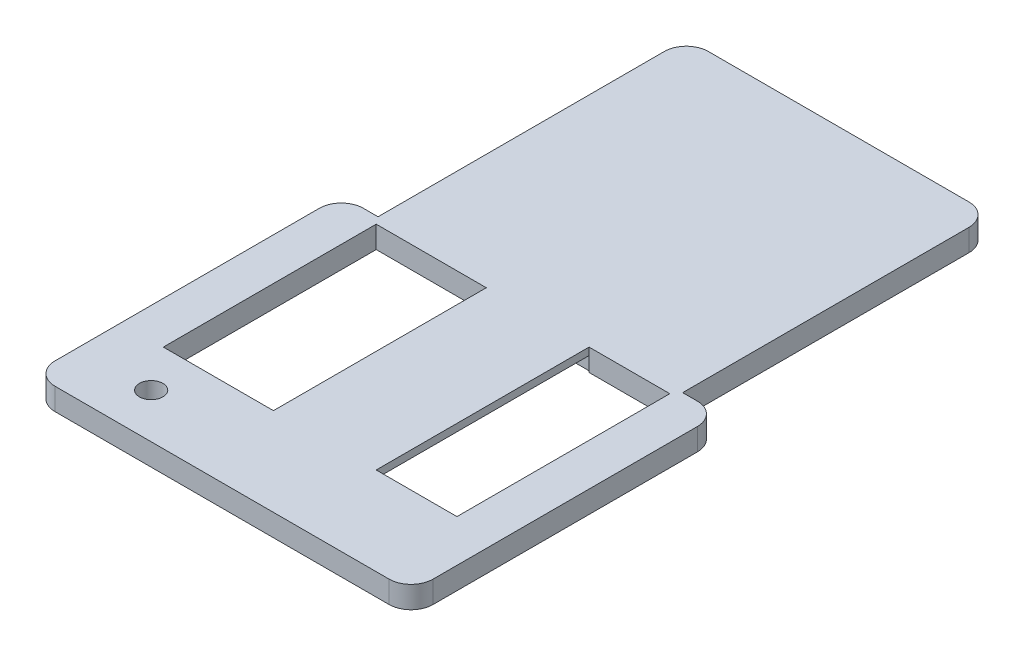
ISO-10303-21;
HEADER;
FILE_DESCRIPTION(('STEP AP214'),'2;1');
FILE_NAME('part.step','',(''),(''),'','','');
FILE_SCHEMA(('AUTOMOTIVE_DESIGN { 1 0 10303 214 1 1 1 1 }'));
ENDSEC;
DATA;
#1=APPLICATION_CONTEXT('core data for automotive mechanical design processes');
#2=APPLICATION_PROTOCOL_DEFINITION('international standard','automotive_design',2000,#1);
#3=PRODUCT_CONTEXT('',#1,'mechanical');
#4=PRODUCT('Part','Part','',(#3));
#5=PRODUCT_RELATED_PRODUCT_CATEGORY('part','',(#4));
#6=PRODUCT_DEFINITION_FORMATION('','',#4);
#7=PRODUCT_DEFINITION_CONTEXT('part definition',#1,'design');
#8=PRODUCT_DEFINITION('design','',#6,#7);
#9=PRODUCT_DEFINITION_SHAPE('','',#8);
#10=(LENGTH_UNIT() NAMED_UNIT(*) SI_UNIT(.MILLI.,.METRE.));
#11=(NAMED_UNIT(*) PLANE_ANGLE_UNIT() SI_UNIT($,.RADIAN.));
#12=(NAMED_UNIT(*) SI_UNIT($,.STERADIAN.) SOLID_ANGLE_UNIT());
#13=UNCERTAINTY_MEASURE_WITH_UNIT(LENGTH_MEASURE(1.E-05),#10,'distance_accuracy_value','');
#14=(GEOMETRIC_REPRESENTATION_CONTEXT(3) GLOBAL_UNCERTAINTY_ASSIGNED_CONTEXT((#13)) GLOBAL_UNIT_ASSIGNED_CONTEXT((#10,
#11,#12)) REPRESENTATION_CONTEXT('',''));
#15=CARTESIAN_POINT('',(0.,0.,0.));
#16=DIRECTION('',(0.,0.,1.));
#17=DIRECTION('',(1.,0.,0.));
#18=AXIS2_PLACEMENT_3D('',#15,#16,#17);
#19=CARTESIAN_POINT('',(20.75,3.,-42.));
#20=DIRECTION('',(0.,0.,1.));
#21=DIRECTION('',(1.,0.,0.));
#22=AXIS2_PLACEMENT_3D('',#19,#20,#21);
#23=PLANE('',#22);
#24=DIRECTION('',(-1.,0.,0.));
#25=VECTOR('',#24,1.);
#26=CARTESIAN_POINT('',(20.75,0.,-42.));
#27=LINE('',#26,#25);
#28=CARTESIAN_POINT('',(17.75,0.,-42.));
#29=VERTEX_POINT('',#28);
#30=CARTESIAN_POINT('',(-17.75,0.,-42.));
#31=VERTEX_POINT('',#30);
#32=EDGE_CURVE('E325',#29,#31,#27,.T.);
#33=ORIENTED_EDGE('',*,*,#32,.T.);
#34=DIRECTION('',(0.,-1.,0.));
#35=VECTOR('',#34,1.);
#36=CARTESIAN_POINT('',(-17.75,3.,-42.));
#37=LINE('',#36,#35);
#38=CARTESIAN_POINT('',(-17.75,3.,-42.));
#39=VERTEX_POINT('',#38);
#40=EDGE_CURVE('E41',#31,#39,#37,.F.);
#41=ORIENTED_EDGE('',*,*,#40,.T.);
#42=DIRECTION('',(-1.,0.,0.));
#43=VECTOR('',#42,1.);
#44=CARTESIAN_POINT('',(20.75,3.,-42.));
#45=LINE('',#44,#43);
#46=CARTESIAN_POINT('',(17.75,3.,-42.));
#47=VERTEX_POINT('',#46);
#48=EDGE_CURVE('E334',#47,#39,#45,.T.);
#49=ORIENTED_EDGE('',*,*,#48,.F.);
#50=DIRECTION('',(0.,-1.,0.));
#51=VECTOR('',#50,1.);
#52=CARTESIAN_POINT('',(17.75,3.,-42.));
#53=LINE('',#52,#51);
#54=EDGE_CURVE('E430',#47,#29,#53,.T.);
#55=ORIENTED_EDGE('',*,*,#54,.T.);
#56=EDGE_LOOP('',(#33,#41,#49,#55));
#57=FACE_BOUND('',#56,.T.);
#58=ADVANCED_FACE('F33',(#57),#23,.F.);
#59=CARTESIAN_POINT('',(-20.75,3.,-42.));
#60=DIRECTION('',(1.,0.,0.));
#61=DIRECTION('',(0.,0.,-1.));
#62=AXIS2_PLACEMENT_3D('',#59,#60,#61);
#63=PLANE('',#62);
#64=DIRECTION('',(0.,0.,1.));
#65=VECTOR('',#64,1.);
#66=CARTESIAN_POINT('',(-20.75,3.,-42.));
#67=LINE('',#66,#65);
#68=CARTESIAN_POINT('',(-20.75,3.,-39.));
#69=VERTEX_POINT('',#68);
#70=CARTESIAN_POINT('',(-20.75,3.,0.));
#71=VERTEX_POINT('',#70);
#72=EDGE_CURVE('E337',#69,#71,#67,.T.);
#73=ORIENTED_EDGE('',*,*,#72,.F.);
#74=DIRECTION('',(0.,-1.,0.));
#75=VECTOR('',#74,1.);
#76=CARTESIAN_POINT('',(-20.75,3.,-39.));
#77=LINE('',#76,#75);
#78=CARTESIAN_POINT('',(-20.75,0.,-39.));
#79=VERTEX_POINT('',#78);
#80=EDGE_CURVE('E427',#69,#79,#77,.T.);
#81=ORIENTED_EDGE('',*,*,#80,.T.);
#82=DIRECTION('',(0.,0.,1.));
#83=VECTOR('',#82,1.);
#84=CARTESIAN_POINT('',(-20.75,0.,-42.));
#85=LINE('',#84,#83);
#86=CARTESIAN_POINT('',(-20.75,0.,0.));
#87=VERTEX_POINT('',#86);
#88=EDGE_CURVE('E360',#79,#87,#85,.T.);
#89=ORIENTED_EDGE('',*,*,#88,.T.);
#90=DIRECTION('',(0.,-1.,0.));
#91=VECTOR('',#90,1.);
#92=CARTESIAN_POINT('',(-20.75,3.,0.));
#93=LINE('',#92,#91);
#94=EDGE_CURVE('E380',#71,#87,#93,.T.);
#95=ORIENTED_EDGE('',*,*,#94,.F.);
#96=EDGE_LOOP('',(#73,#81,#89,#95));
#97=FACE_BOUND('',#96,.T.);
#98=ADVANCED_FACE('F447',(#97),#63,.F.);
#99=CARTESIAN_POINT('',(-20.75,3.,0.));
#100=DIRECTION('',(0.,0.,1.));
#101=DIRECTION('',(1.,0.,0.));
#102=AXIS2_PLACEMENT_3D('',#99,#100,#101);
#103=PLANE('',#102);
#104=DIRECTION('',(-1.,0.,0.));
#105=VECTOR('',#104,1.);
#106=CARTESIAN_POINT('',(-20.75,0.,0.));
#107=LINE('',#106,#105);
#108=CARTESIAN_POINT('',(-22.75,0.,0.));
#109=VERTEX_POINT('',#108);
#110=EDGE_CURVE('E362',#87,#109,#107,.T.);
#111=ORIENTED_EDGE('',*,*,#110,.T.);
#112=DIRECTION('',(0.,-1.,0.));
#113=VECTOR('',#112,1.);
#114=CARTESIAN_POINT('',(-22.75,3.,0.));
#115=LINE('',#114,#113);
#116=CARTESIAN_POINT('',(-22.75,3.,0.));
#117=VERTEX_POINT('',#116);
#118=EDGE_CURVE('E425',#109,#117,#115,.F.);
#119=ORIENTED_EDGE('',*,*,#118,.T.);
#120=DIRECTION('',(-1.,0.,0.));
#121=VECTOR('',#120,1.);
#122=CARTESIAN_POINT('',(-20.75,3.,0.));
#123=LINE('',#122,#121);
#124=EDGE_CURVE('E340',#71,#117,#123,.T.);
#125=ORIENTED_EDGE('',*,*,#124,.F.);
#126=ORIENTED_EDGE('',*,*,#94,.T.);
#127=EDGE_LOOP('',(#111,#119,#125,#126));
#128=FACE_BOUND('',#127,.T.);
#129=ADVANCED_FACE('F456',(#128),#103,.F.);
#130=CARTESIAN_POINT('',(-25.75,3.,0.));
#131=DIRECTION('',(1.,0.,0.));
#132=DIRECTION('',(0.,0.,-1.));
#133=AXIS2_PLACEMENT_3D('',#130,#131,#132);
#134=PLANE('',#133);
#135=DIRECTION('',(0.,0.,1.));
#136=VECTOR('',#135,1.);
#137=CARTESIAN_POINT('',(-25.75,0.,0.));
#138=LINE('',#137,#136);
#139=CARTESIAN_POINT('',(-25.75,0.,3.));
#140=VERTEX_POINT('',#139);
#141=CARTESIAN_POINT('',(-25.75,0.,39.));
#142=VERTEX_POINT('',#141);
#143=EDGE_CURVE('E365',#140,#142,#138,.T.);
#144=ORIENTED_EDGE('',*,*,#143,.T.);
#145=DIRECTION('',(0.,-1.,0.));
#146=VECTOR('',#145,1.);
#147=CARTESIAN_POINT('',(-25.75,3.,39.));
#148=LINE('',#147,#146);
#149=CARTESIAN_POINT('',(-25.75,3.,39.));
#150=VERTEX_POINT('',#149);
#151=EDGE_CURVE('E423',#142,#150,#148,.F.);
#152=ORIENTED_EDGE('',*,*,#151,.T.);
#153=DIRECTION('',(0.,0.,1.));
#154=VECTOR('',#153,1.);
#155=CARTESIAN_POINT('',(-25.75,3.,0.));
#156=LINE('',#155,#154);
#157=CARTESIAN_POINT('',(-25.75,3.,3.));
#158=VERTEX_POINT('',#157);
#159=EDGE_CURVE('E343',#158,#150,#156,.T.);
#160=ORIENTED_EDGE('',*,*,#159,.F.);
#161=DIRECTION('',(0.,-1.,0.));
#162=VECTOR('',#161,1.);
#163=CARTESIAN_POINT('',(-25.75,3.,3.));
#164=LINE('',#163,#162);
#165=EDGE_CURVE('E420',#158,#140,#164,.T.);
#166=ORIENTED_EDGE('',*,*,#165,.T.);
#167=EDGE_LOOP('',(#144,#152,#160,#166));
#168=FACE_BOUND('',#167,.T.);
#169=ADVANCED_FACE('F465',(#168),#134,.F.);
#170=CARTESIAN_POINT('',(-25.75,3.,42.));
#171=DIRECTION('',(0.,0.,-1.));
#172=DIRECTION('',(-1.,0.,0.));
#173=AXIS2_PLACEMENT_3D('',#170,#171,#172);
#174=PLANE('',#173);
#175=DIRECTION('',(1.,0.,0.));
#176=VECTOR('',#175,1.);
#177=CARTESIAN_POINT('',(-25.75,0.,42.));
#178=LINE('',#177,#176);
#179=CARTESIAN_POINT('',(-22.75,0.,42.));
#180=VERTEX_POINT('',#179);
#181=CARTESIAN_POINT('',(22.75,0.,42.));
#182=VERTEX_POINT('',#181);
#183=EDGE_CURVE('E368',#180,#182,#178,.T.);
#184=ORIENTED_EDGE('',*,*,#183,.T.);
#185=DIRECTION('',(0.,-1.,0.));
#186=VECTOR('',#185,1.);
#187=CARTESIAN_POINT('',(22.75,3.,42.));
#188=LINE('',#187,#186);
#189=CARTESIAN_POINT('',(22.75,3.,42.));
#190=VERTEX_POINT('',#189);
#191=EDGE_CURVE('E418',#182,#190,#188,.F.);
#192=ORIENTED_EDGE('',*,*,#191,.T.);
#193=DIRECTION('',(1.,0.,0.));
#194=VECTOR('',#193,1.);
#195=CARTESIAN_POINT('',(-25.75,3.,42.));
#196=LINE('',#195,#194);
#197=CARTESIAN_POINT('',(-22.75,3.,42.));
#198=VERTEX_POINT('',#197);
#199=EDGE_CURVE('E346',#198,#190,#196,.T.);
#200=ORIENTED_EDGE('',*,*,#199,.F.);
#201=DIRECTION('',(0.,-1.,0.));
#202=VECTOR('',#201,1.);
#203=CARTESIAN_POINT('',(-22.75,3.,42.));
#204=LINE('',#203,#202);
#205=EDGE_CURVE('E415',#198,#180,#204,.T.);
#206=ORIENTED_EDGE('',*,*,#205,.T.);
#207=EDGE_LOOP('',(#184,#192,#200,#206));
#208=FACE_BOUND('',#207,.T.);
#209=ADVANCED_FACE('F473',(#208),#174,.F.);
#210=CARTESIAN_POINT('',(25.75,3.,42.));
#211=DIRECTION('',(-1.,0.,0.));
#212=DIRECTION('',(0.,0.,1.));
#213=AXIS2_PLACEMENT_3D('',#210,#211,#212);
#214=PLANE('',#213);
#215=DIRECTION('',(0.,0.,-1.));
#216=VECTOR('',#215,1.);
#217=CARTESIAN_POINT('',(25.75,0.,42.));
#218=LINE('',#217,#216);
#219=CARTESIAN_POINT('',(25.75,0.,39.));
#220=VERTEX_POINT('',#219);
#221=CARTESIAN_POINT('',(25.75,0.,3.));
#222=VERTEX_POINT('',#221);
#223=EDGE_CURVE('E371',#220,#222,#218,.T.);
#224=ORIENTED_EDGE('',*,*,#223,.T.);
#225=DIRECTION('',(0.,-1.,0.));
#226=VECTOR('',#225,1.);
#227=CARTESIAN_POINT('',(25.75,3.,3.));
#228=LINE('',#227,#226);
#229=CARTESIAN_POINT('',(25.75,3.,3.));
#230=VERTEX_POINT('',#229);
#231=EDGE_CURVE('E401',#222,#230,#228,.F.);
#232=ORIENTED_EDGE('',*,*,#231,.T.);
#233=DIRECTION('',(0.,0.,-1.));
#234=VECTOR('',#233,1.);
#235=CARTESIAN_POINT('',(25.75,3.,42.));
#236=LINE('',#235,#234);
#237=CARTESIAN_POINT('',(25.75,3.,39.));
#238=VERTEX_POINT('',#237);
#239=EDGE_CURVE('E349',#238,#230,#236,.T.);
#240=ORIENTED_EDGE('',*,*,#239,.F.);
#241=DIRECTION('',(0.,-1.,0.));
#242=VECTOR('',#241,1.);
#243=CARTESIAN_POINT('',(25.75,3.,39.));
#244=LINE('',#243,#242);
#245=EDGE_CURVE('E398',#238,#220,#244,.T.);
#246=ORIENTED_EDGE('',*,*,#245,.T.);
#247=EDGE_LOOP('',(#224,#232,#240,#246));
#248=FACE_BOUND('',#247,.T.);
#249=ADVANCED_FACE('F482',(#248),#214,.F.);
#250=CARTESIAN_POINT('',(25.75,3.,0.));
#251=DIRECTION('',(0.,0.,1.));
#252=DIRECTION('',(1.,0.,0.));
#253=AXIS2_PLACEMENT_3D('',#250,#251,#252);
#254=PLANE('',#253);
#255=DIRECTION('',(-1.,0.,0.));
#256=VECTOR('',#255,1.);
#257=CARTESIAN_POINT('',(25.75,3.,0.));
#258=LINE('',#257,#256);
#259=CARTESIAN_POINT('',(22.75,3.,0.));
#260=VERTEX_POINT('',#259);
#261=CARTESIAN_POINT('',(20.75,3.,0.));
#262=VERTEX_POINT('',#261);
#263=EDGE_CURVE('E352',#260,#262,#258,.T.);
#264=ORIENTED_EDGE('',*,*,#263,.F.);
#265=DIRECTION('',(0.,-1.,0.));
#266=VECTOR('',#265,1.);
#267=CARTESIAN_POINT('',(22.75,3.,0.));
#268=LINE('',#267,#266);
#269=CARTESIAN_POINT('',(22.75,0.,0.));
#270=VERTEX_POINT('',#269);
#271=EDGE_CURVE('E383',#260,#270,#268,.T.);
#272=ORIENTED_EDGE('',*,*,#271,.T.);
#273=DIRECTION('',(-1.,0.,0.));
#274=VECTOR('',#273,1.);
#275=CARTESIAN_POINT('',(25.75,0.,0.));
#276=LINE('',#275,#274);
#277=CARTESIAN_POINT('',(20.75,0.,0.));
#278=VERTEX_POINT('',#277);
#279=EDGE_CURVE('E374',#270,#278,#276,.T.);
#280=ORIENTED_EDGE('',*,*,#279,.T.);
#281=DIRECTION('',(0.,-1.,0.));
#282=VECTOR('',#281,1.);
#283=CARTESIAN_POINT('',(20.75,3.,0.));
#284=LINE('',#283,#282);
#285=EDGE_CURVE('E357',#262,#278,#284,.T.);
#286=ORIENTED_EDGE('',*,*,#285,.F.);
#287=EDGE_LOOP('',(#264,#272,#280,#286));
#288=FACE_BOUND('',#287,.T.);
#289=ADVANCED_FACE('F491',(#288),#254,.F.);
#290=CARTESIAN_POINT('',(20.75,3.,0.));
#291=DIRECTION('',(-1.,0.,0.));
#292=DIRECTION('',(0.,0.,1.));
#293=AXIS2_PLACEMENT_3D('',#290,#291,#292);
#294=PLANE('',#293);
#295=DIRECTION('',(0.,0.,-1.));
#296=VECTOR('',#295,1.);
#297=CARTESIAN_POINT('',(20.75,0.,0.));
#298=LINE('',#297,#296);
#299=CARTESIAN_POINT('',(20.75,0.,-39.));
#300=VERTEX_POINT('',#299);
#301=EDGE_CURVE('E338',#278,#300,#298,.T.);
#302=ORIENTED_EDGE('',*,*,#301,.T.);
#303=DIRECTION('',(0.,-1.,0.));
#304=VECTOR('',#303,1.);
#305=CARTESIAN_POINT('',(20.75,3.,-39.));
#306=LINE('',#305,#304);
#307=CARTESIAN_POINT('',(20.75,3.,-39.));
#308=VERTEX_POINT('',#307);
#309=EDGE_CURVE('E11',#300,#308,#306,.F.);
#310=ORIENTED_EDGE('',*,*,#309,.T.);
#311=DIRECTION('',(0.,0.,-1.));
#312=VECTOR('',#311,1.);
#313=CARTESIAN_POINT('',(20.75,3.,0.));
#314=LINE('',#313,#312);
#315=EDGE_CURVE('E354',#262,#308,#314,.T.);
#316=ORIENTED_EDGE('',*,*,#315,.F.);
#317=ORIENTED_EDGE('',*,*,#285,.T.);
#318=EDGE_LOOP('',(#302,#310,#316,#317));
#319=FACE_BOUND('',#318,.T.);
#320=ADVANCED_FACE('F495',(#319),#294,.F.);
#321=CARTESIAN_POINT('',(0.,3.,0.));
#322=DIRECTION('',(0.,1.,0.));
#323=DIRECTION('',(0.,0.,1.));
#324=AXIS2_PLACEMENT_3D('',#321,#322,#323);
#325=PLANE('',#324);
#326=CARTESIAN_POINT('',(-15.75,3.,35.907418342434));
#327=DIRECTION('',(0.,1.,0.));
#328=DIRECTION('',(0.,0.,1.));
#329=AXIS2_PLACEMENT_3D('',#326,#327,#328);
#330=CIRCLE('',#329,1.6);
#331=CARTESIAN_POINT('',(-15.75,3.,37.507418342434));
#332=VERTEX_POINT('',#331);
#333=EDGE_CURVE('E263',#332,#332,#330,.T.);
#334=ORIENTED_EDGE('',*,*,#333,.F.);
#335=EDGE_LOOP('',(#334));
#336=FACE_BOUND('',#335,.T.);
#337=DIRECTION('',(0.,0.,1.));
#338=VECTOR('',#337,1.);
#339=CARTESIAN_POINT('',(9.00000000000001,3.,30.));
#340=LINE('',#339,#338);
#341=CARTESIAN_POINT('',(9.00000000000001,3.,1.));
#342=VERTEX_POINT('',#341);
#343=CARTESIAN_POINT('',(9.00000000000001,3.,30.));
#344=VERTEX_POINT('',#343);
#345=EDGE_CURVE('E271',#342,#344,#340,.T.);
#346=ORIENTED_EDGE('',*,*,#345,.F.);
#347=DIRECTION('',(-1.,0.,0.));
#348=VECTOR('',#347,1.);
#349=CARTESIAN_POINT('',(20.,3.,1.));
#350=LINE('',#349,#348);
#351=CARTESIAN_POINT('',(20.,3.,1.));
#352=VERTEX_POINT('',#351);
#353=EDGE_CURVE('E278',#352,#342,#350,.T.);
#354=ORIENTED_EDGE('',*,*,#353,.F.);
#355=DIRECTION('',(0.,0.,-1.));
#356=VECTOR('',#355,1.);
#357=CARTESIAN_POINT('',(20.,3.,30.));
#358=LINE('',#357,#356);
#359=CARTESIAN_POINT('',(20.,3.,30.));
#360=VERTEX_POINT('',#359);
#361=EDGE_CURVE('E287',#360,#352,#358,.T.);
#362=ORIENTED_EDGE('',*,*,#361,.F.);
#363=DIRECTION('',(1.,0.,0.));
#364=VECTOR('',#363,1.);
#365=CARTESIAN_POINT('',(20.,3.,30.));
#366=LINE('',#365,#364);
#367=EDGE_CURVE('E285',#344,#360,#366,.T.);
#368=ORIENTED_EDGE('',*,*,#367,.F.);
#369=EDGE_LOOP('',(#346,#354,#362,#368));
#370=FACE_BOUND('',#369,.T.);
#371=DIRECTION('',(0.,0.,-1.));
#372=VECTOR('',#371,1.);
#373=CARTESIAN_POINT('',(-4.99999999999999,3.,1.));
#374=LINE('',#373,#372);
#375=CARTESIAN_POINT('',(-4.99999999999999,3.,30.));
#376=VERTEX_POINT('',#375);
#377=CARTESIAN_POINT('',(-4.99999999999999,3.,1.));
#378=VERTEX_POINT('',#377);
#379=EDGE_CURVE('E294',#376,#378,#374,.T.);
#380=ORIENTED_EDGE('',*,*,#379,.F.);
#381=DIRECTION('',(1.,0.,0.));
#382=VECTOR('',#381,1.);
#383=CARTESIAN_POINT('',(-20.,3.,30.));
#384=LINE('',#383,#382);
#385=CARTESIAN_POINT('',(-20.,3.,30.));
#386=VERTEX_POINT('',#385);
#387=EDGE_CURVE('E306',#386,#376,#384,.T.);
#388=ORIENTED_EDGE('',*,*,#387,.F.);
#389=DIRECTION('',(0.,0.,1.));
#390=VECTOR('',#389,1.);
#391=CARTESIAN_POINT('',(-20.,3.,1.));
#392=LINE('',#391,#390);
#393=CARTESIAN_POINT('',(-20.,3.,1.));
#394=VERTEX_POINT('',#393);
#395=EDGE_CURVE('E318',#394,#386,#392,.T.);
#396=ORIENTED_EDGE('',*,*,#395,.F.);
#397=DIRECTION('',(-1.,0.,0.));
#398=VECTOR('',#397,1.);
#399=CARTESIAN_POINT('',(-20.,3.,1.));
#400=LINE('',#399,#398);
#401=EDGE_CURVE('E315',#378,#394,#400,.T.);
#402=ORIENTED_EDGE('',*,*,#401,.F.);
#403=EDGE_LOOP('',(#380,#388,#396,#402));
#404=FACE_BOUND('',#403,.T.);
#405=ORIENTED_EDGE('',*,*,#239,.T.);
#406=CARTESIAN_POINT('',(22.75,3.,3.));
#407=DIRECTION('',(0.,1.,0.));
#408=DIRECTION('',(0.,0.,1.));
#409=AXIS2_PLACEMENT_3D('',#406,#407,#408);
#410=CIRCLE('',#409,3.);
#411=EDGE_CURVE('E413',#230,#260,#410,.T.);
#412=ORIENTED_EDGE('',*,*,#411,.T.);
#413=ORIENTED_EDGE('',*,*,#263,.T.);
#414=ORIENTED_EDGE('',*,*,#315,.T.);
#415=CARTESIAN_POINT('',(17.75,3.,-39.));
#416=DIRECTION('',(0.,1.,0.));
#417=DIRECTION('',(0.,0.,1.));
#418=AXIS2_PLACEMENT_3D('',#415,#416,#417);
#419=CIRCLE('',#418,3.);
#420=EDGE_CURVE('E403',#308,#47,#419,.T.);
#421=ORIENTED_EDGE('',*,*,#420,.T.);
#422=ORIENTED_EDGE('',*,*,#48,.T.);
#423=CARTESIAN_POINT('',(-17.75,3.,-39.));
#424=DIRECTION('',(0.,1.,0.));
#425=DIRECTION('',(0.,0.,1.));
#426=AXIS2_PLACEMENT_3D('',#423,#424,#425);
#427=CIRCLE('',#426,3.);
#428=EDGE_CURVE('E405',#39,#69,#427,.T.);
#429=ORIENTED_EDGE('',*,*,#428,.T.);
#430=ORIENTED_EDGE('',*,*,#72,.T.);
#431=ORIENTED_EDGE('',*,*,#124,.T.);
#432=CARTESIAN_POINT('',(-22.75,3.,3.));
#433=DIRECTION('',(0.,1.,0.));
#434=DIRECTION('',(0.,0.,1.));
#435=AXIS2_PLACEMENT_3D('',#432,#433,#434);
#436=CIRCLE('',#435,3.);
#437=EDGE_CURVE('E407',#117,#158,#436,.T.);
#438=ORIENTED_EDGE('',*,*,#437,.T.);
#439=ORIENTED_EDGE('',*,*,#159,.T.);
#440=CARTESIAN_POINT('',(-22.75,3.,39.));
#441=DIRECTION('',(0.,1.,0.));
#442=DIRECTION('',(0.,0.,1.));
#443=AXIS2_PLACEMENT_3D('',#440,#441,#442);
#444=CIRCLE('',#443,3.);
#445=EDGE_CURVE('E409',#150,#198,#444,.T.);
#446=ORIENTED_EDGE('',*,*,#445,.T.);
#447=ORIENTED_EDGE('',*,*,#199,.T.);
#448=CARTESIAN_POINT('',(22.75,3.,39.));
#449=DIRECTION('',(0.,1.,0.));
#450=DIRECTION('',(0.,0.,1.));
#451=AXIS2_PLACEMENT_3D('',#448,#449,#450);
#452=CIRCLE('',#451,3.);
#453=EDGE_CURVE('E411',#190,#238,#452,.T.);
#454=ORIENTED_EDGE('',*,*,#453,.T.);
#455=EDGE_LOOP('',(#405,#412,#413,#414,#421,#422,#429,#430,#431,#438,#439,#446,#447,#454));
#456=FACE_BOUND('',#455,.T.);
#457=ADVANCED_FACE('F440',(#336,#370,#404,#456),#325,.T.);
#458=CARTESIAN_POINT('',(0.,0.,0.));
#459=DIRECTION('',(0.,1.,0.));
#460=DIRECTION('',(0.,0.,1.));
#461=AXIS2_PLACEMENT_3D('',#458,#459,#460);
#462=PLANE('',#461);
#463=CARTESIAN_POINT('',(-15.75,0.,35.907418342434));
#464=DIRECTION('',(0.,1.,0.));
#465=DIRECTION('',(0.,0.,1.));
#466=AXIS2_PLACEMENT_3D('',#463,#464,#465);
#467=CIRCLE('',#466,1.6);
#468=CARTESIAN_POINT('',(-15.75,0.,37.507418342434));
#469=VERTEX_POINT('',#468);
#470=EDGE_CURVE('E268',#469,#469,#467,.T.);
#471=ORIENTED_EDGE('',*,*,#470,.T.);
#472=EDGE_LOOP('',(#471));
#473=FACE_BOUND('',#472,.T.);
#474=DIRECTION('',(1.,0.,0.));
#475=VECTOR('',#474,1.);
#476=CARTESIAN_POINT('',(-20.,0.,30.));
#477=LINE('',#476,#475);
#478=CARTESIAN_POINT('',(-20.,0.,30.));
#479=VERTEX_POINT('',#478);
#480=CARTESIAN_POINT('',(-4.99999999999999,0.,30.));
#481=VERTEX_POINT('',#480);
#482=EDGE_CURVE('E309',#479,#481,#477,.T.);
#483=ORIENTED_EDGE('',*,*,#482,.T.);
#484=DIRECTION('',(0.,0.,-1.));
#485=VECTOR('',#484,1.);
#486=CARTESIAN_POINT('',(-4.99999999999999,0.,30.2));
#487=LINE('',#486,#485);
#488=CARTESIAN_POINT('',(-4.99999999999999,0.,30.2));
#489=VERTEX_POINT('',#488);
#490=EDGE_CURVE('E252',#489,#481,#487,.T.);
#491=ORIENTED_EDGE('',*,*,#490,.F.);
#492=DIRECTION('',(-1.,0.,0.));
#493=VECTOR('',#492,1.);
#494=CARTESIAN_POINT('',(9.00000000000001,0.,30.2));
#495=LINE('',#494,#493);
#496=CARTESIAN_POINT('',(9.00000000000001,0.,30.2));
#497=VERTEX_POINT('',#496);
#498=EDGE_CURVE('E229',#497,#489,#495,.T.);
#499=ORIENTED_EDGE('',*,*,#498,.F.);
#500=DIRECTION('',(0.,0.,1.));
#501=VECTOR('',#500,1.);
#502=CARTESIAN_POINT('',(9.00000000000001,0.,30.2));
#503=LINE('',#502,#501);
#504=CARTESIAN_POINT('',(9.00000000000001,0.,30.));
#505=VERTEX_POINT('',#504);
#506=EDGE_CURVE('E256',#505,#497,#503,.T.);
#507=ORIENTED_EDGE('',*,*,#506,.F.);
#508=DIRECTION('',(1.,0.,0.));
#509=VECTOR('',#508,1.);
#510=CARTESIAN_POINT('',(20.,0.,30.));
#511=LINE('',#510,#509);
#512=CARTESIAN_POINT('',(20.,0.,30.));
#513=VERTEX_POINT('',#512);
#514=EDGE_CURVE('E274',#505,#513,#511,.T.);
#515=ORIENTED_EDGE('',*,*,#514,.T.);
#516=DIRECTION('',(0.,0.,-1.));
#517=VECTOR('',#516,1.);
#518=CARTESIAN_POINT('',(20.,0.,30.));
#519=LINE('',#518,#517);
#520=CARTESIAN_POINT('',(20.,0.,1.));
#521=VERTEX_POINT('',#520);
#522=EDGE_CURVE('E277',#513,#521,#519,.T.);
#523=ORIENTED_EDGE('',*,*,#522,.T.);
#524=DIRECTION('',(-1.,0.,0.));
#525=VECTOR('',#524,1.);
#526=CARTESIAN_POINT('',(20.,0.,1.));
#527=LINE('',#526,#525);
#528=CARTESIAN_POINT('',(9.00000000000001,0.,1.));
#529=VERTEX_POINT('',#528);
#530=EDGE_CURVE('E281',#521,#529,#527,.T.);
#531=ORIENTED_EDGE('',*,*,#530,.T.);
#532=CARTESIAN_POINT('',(9.00000000000001,0.,0.800000000000002));
#533=VERTEX_POINT('',#532);
#534=EDGE_CURVE('E257',#533,#529,#503,.T.);
#535=ORIENTED_EDGE('',*,*,#534,.F.);
#536=DIRECTION('',(1.,0.,0.));
#537=VECTOR('',#536,1.);
#538=CARTESIAN_POINT('',(9.00000000000001,0.,0.800000000000002));
#539=LINE('',#538,#537);
#540=CARTESIAN_POINT('',(-4.99999999999999,0.,0.800000000000002));
#541=VERTEX_POINT('',#540);
#542=EDGE_CURVE('E254',#541,#533,#539,.T.);
#543=ORIENTED_EDGE('',*,*,#542,.F.);
#544=CARTESIAN_POINT('',(-4.99999999999999,0.,1.));
#545=VERTEX_POINT('',#544);
#546=EDGE_CURVE('E236',#545,#541,#487,.T.);
#547=ORIENTED_EDGE('',*,*,#546,.F.);
#548=DIRECTION('',(-1.,0.,0.));
#549=VECTOR('',#548,1.);
#550=CARTESIAN_POINT('',(-20.,0.,1.));
#551=LINE('',#550,#549);
#552=CARTESIAN_POINT('',(-20.,0.,1.));
#553=VERTEX_POINT('',#552);
#554=EDGE_CURVE('E302',#545,#553,#551,.T.);
#555=ORIENTED_EDGE('',*,*,#554,.T.);
#556=DIRECTION('',(0.,0.,1.));
#557=VECTOR('',#556,1.);
#558=CARTESIAN_POINT('',(-20.,0.,1.));
#559=LINE('',#558,#557);
#560=EDGE_CURVE('E305',#553,#479,#559,.T.);
#561=ORIENTED_EDGE('',*,*,#560,.T.);
#562=EDGE_LOOP('',(#483,#491,#499,#507,#515,#523,#531,#535,#543,#547,#555,#561));
#563=FACE_BOUND('',#562,.T.);
#564=ORIENTED_EDGE('',*,*,#279,.F.);
#565=CARTESIAN_POINT('',(22.75,0.,3.));
#566=DIRECTION('',(0.,1.,0.));
#567=DIRECTION('',(0.,0.,1.));
#568=AXIS2_PLACEMENT_3D('',#565,#566,#567);
#569=CIRCLE('',#568,3.);
#570=EDGE_CURVE('E396',#270,#222,#569,.F.);
#571=ORIENTED_EDGE('',*,*,#570,.T.);
#572=ORIENTED_EDGE('',*,*,#223,.F.);
#573=CARTESIAN_POINT('',(22.75,0.,39.));
#574=DIRECTION('',(0.,1.,0.));
#575=DIRECTION('',(0.,0.,1.));
#576=AXIS2_PLACEMENT_3D('',#573,#574,#575);
#577=CIRCLE('',#576,3.);
#578=EDGE_CURVE('E394',#220,#182,#577,.F.);
#579=ORIENTED_EDGE('',*,*,#578,.T.);
#580=ORIENTED_EDGE('',*,*,#183,.F.);
#581=CARTESIAN_POINT('',(-22.75,0.,39.));
#582=DIRECTION('',(0.,1.,0.));
#583=DIRECTION('',(0.,0.,1.));
#584=AXIS2_PLACEMENT_3D('',#581,#582,#583);
#585=CIRCLE('',#584,3.);
#586=EDGE_CURVE('E392',#180,#142,#585,.F.);
#587=ORIENTED_EDGE('',*,*,#586,.T.);
#588=ORIENTED_EDGE('',*,*,#143,.F.);
#589=CARTESIAN_POINT('',(-22.75,0.,3.));
#590=DIRECTION('',(0.,1.,0.));
#591=DIRECTION('',(0.,0.,1.));
#592=AXIS2_PLACEMENT_3D('',#589,#590,#591);
#593=CIRCLE('',#592,3.);
#594=EDGE_CURVE('E390',#140,#109,#593,.F.);
#595=ORIENTED_EDGE('',*,*,#594,.T.);
#596=ORIENTED_EDGE('',*,*,#110,.F.);
#597=ORIENTED_EDGE('',*,*,#88,.F.);
#598=CARTESIAN_POINT('',(-17.75,0.,-39.));
#599=DIRECTION('',(0.,1.,0.));
#600=DIRECTION('',(0.,0.,1.));
#601=AXIS2_PLACEMENT_3D('',#598,#599,#600);
#602=CIRCLE('',#601,3.);
#603=EDGE_CURVE('E388',#79,#31,#602,.F.);
#604=ORIENTED_EDGE('',*,*,#603,.T.);
#605=ORIENTED_EDGE('',*,*,#32,.F.);
#606=CARTESIAN_POINT('',(17.75,0.,-39.));
#607=DIRECTION('',(0.,1.,0.));
#608=DIRECTION('',(0.,0.,1.));
#609=AXIS2_PLACEMENT_3D('',#606,#607,#608);
#610=CIRCLE('',#609,3.);
#611=EDGE_CURVE('E386',#29,#300,#610,.F.);
#612=ORIENTED_EDGE('',*,*,#611,.T.);
#613=ORIENTED_EDGE('',*,*,#301,.F.);
#614=EDGE_LOOP('',(#564,#571,#572,#579,#580,#587,#588,#595,#596,#597,#604,#605,#612,#613));
#615=FACE_BOUND('',#614,.T.);
#616=ADVANCED_FACE('F452',(#473,#563,#615),#462,.F.);
#617=CARTESIAN_POINT('',(22.75,3.,3.));
#618=DIRECTION('',(0.,-1.,0.));
#619=DIRECTION('',(0.,0.,-1.));
#620=AXIS2_PLACEMENT_3D('',#617,#618,#619);
#621=CYLINDRICAL_SURFACE('',#620,3.);
#622=ORIENTED_EDGE('',*,*,#411,.F.);
#623=ORIENTED_EDGE('',*,*,#231,.F.);
#624=ORIENTED_EDGE('',*,*,#570,.F.);
#625=ORIENTED_EDGE('',*,*,#271,.F.);
#626=EDGE_LOOP('',(#622,#623,#624,#625));
#627=FACE_BOUND('',#626,.T.);
#628=ADVANCED_FACE('F486',(#627),#621,.T.);
#629=CARTESIAN_POINT('',(22.75,3.,39.));
#630=DIRECTION('',(0.,-1.,0.));
#631=DIRECTION('',(0.,0.,-1.));
#632=AXIS2_PLACEMENT_3D('',#629,#630,#631);
#633=CYLINDRICAL_SURFACE('',#632,3.);
#634=ORIENTED_EDGE('',*,*,#453,.F.);
#635=ORIENTED_EDGE('',*,*,#191,.F.);
#636=ORIENTED_EDGE('',*,*,#578,.F.);
#637=ORIENTED_EDGE('',*,*,#245,.F.);
#638=EDGE_LOOP('',(#634,#635,#636,#637));
#639=FACE_BOUND('',#638,.T.);
#640=ADVANCED_FACE('F477',(#639),#633,.T.);
#641=CARTESIAN_POINT('',(-22.75,3.,39.));
#642=DIRECTION('',(0.,-1.,0.));
#643=DIRECTION('',(0.,0.,-1.));
#644=AXIS2_PLACEMENT_3D('',#641,#642,#643);
#645=CYLINDRICAL_SURFACE('',#644,3.);
#646=ORIENTED_EDGE('',*,*,#445,.F.);
#647=ORIENTED_EDGE('',*,*,#151,.F.);
#648=ORIENTED_EDGE('',*,*,#586,.F.);
#649=ORIENTED_EDGE('',*,*,#205,.F.);
#650=EDGE_LOOP('',(#646,#647,#648,#649));
#651=FACE_BOUND('',#650,.T.);
#652=ADVANCED_FACE('F468',(#651),#645,.T.);
#653=CARTESIAN_POINT('',(-22.75,3.,3.));
#654=DIRECTION('',(0.,-1.,0.));
#655=DIRECTION('',(0.,0.,-1.));
#656=AXIS2_PLACEMENT_3D('',#653,#654,#655);
#657=CYLINDRICAL_SURFACE('',#656,3.);
#658=ORIENTED_EDGE('',*,*,#437,.F.);
#659=ORIENTED_EDGE('',*,*,#118,.F.);
#660=ORIENTED_EDGE('',*,*,#594,.F.);
#661=ORIENTED_EDGE('',*,*,#165,.F.);
#662=EDGE_LOOP('',(#658,#659,#660,#661));
#663=FACE_BOUND('',#662,.T.);
#664=ADVANCED_FACE('F460',(#663),#657,.T.);
#665=CARTESIAN_POINT('',(-17.75,3.,-39.));
#666=DIRECTION('',(0.,-1.,0.));
#667=DIRECTION('',(0.,0.,-1.));
#668=AXIS2_PLACEMENT_3D('',#665,#666,#667);
#669=CYLINDRICAL_SURFACE('',#668,3.);
#670=ORIENTED_EDGE('',*,*,#428,.F.);
#671=ORIENTED_EDGE('',*,*,#40,.F.);
#672=ORIENTED_EDGE('',*,*,#603,.F.);
#673=ORIENTED_EDGE('',*,*,#80,.F.);
#674=EDGE_LOOP('',(#670,#671,#672,#673));
#675=FACE_BOUND('',#674,.T.);
#676=ADVANCED_FACE('F444',(#675),#669,.T.);
#677=CARTESIAN_POINT('',(17.75,3.,-39.));
#678=DIRECTION('',(0.,-1.,0.));
#679=DIRECTION('',(0.,0.,-1.));
#680=AXIS2_PLACEMENT_3D('',#677,#678,#679);
#681=CYLINDRICAL_SURFACE('',#680,3.);
#682=ORIENTED_EDGE('',*,*,#420,.F.);
#683=ORIENTED_EDGE('',*,*,#309,.F.);
#684=ORIENTED_EDGE('',*,*,#611,.F.);
#685=ORIENTED_EDGE('',*,*,#54,.F.);
#686=EDGE_LOOP('',(#682,#683,#684,#685));
#687=FACE_BOUND('',#686,.T.);
#688=ADVANCED_FACE('F35',(#687),#681,.T.);
#689=CARTESIAN_POINT('',(-4.99999999999999,0.,1.));
#690=DIRECTION('',(1.,0.,0.));
#691=DIRECTION('',(0.,0.,-1.));
#692=AXIS2_PLACEMENT_3D('',#689,#690,#691);
#693=PLANE('',#692);
#694=DIRECTION('',(0.,1.,0.));
#695=VECTOR('',#694,1.);
#696=CARTESIAN_POINT('',(-4.99999999999999,0.,1.));
#697=LINE('',#696,#695);
#698=CARTESIAN_POINT('',(-4.99999999999999,2.,1.));
#699=VERTEX_POINT('',#698);
#700=EDGE_CURVE('E312',#699,#378,#697,.T.);
#701=ORIENTED_EDGE('',*,*,#700,.F.);
#702=DIRECTION('',(0.,0.,-1.));
#703=VECTOR('',#702,1.);
#704=CARTESIAN_POINT('',(-4.99999999999999,2.,30.2));
#705=LINE('',#704,#703);
#706=CARTESIAN_POINT('',(-4.99999999999999,2.,30.));
#707=VERTEX_POINT('',#706);
#708=EDGE_CURVE('E226',#707,#699,#705,.T.);
#709=ORIENTED_EDGE('',*,*,#708,.F.);
#710=DIRECTION('',(0.,1.,0.));
#711=VECTOR('',#710,1.);
#712=CARTESIAN_POINT('',(-4.99999999999999,0.,30.));
#713=LINE('',#712,#711);
#714=EDGE_CURVE('E326',#707,#376,#713,.T.);
#715=ORIENTED_EDGE('',*,*,#714,.T.);
#716=ORIENTED_EDGE('',*,*,#379,.T.);
#717=EDGE_LOOP('',(#701,#709,#715,#716));
#718=FACE_BOUND('',#717,.T.);
#719=ADVANCED_FACE('F499',(#718),#693,.F.);
#720=CARTESIAN_POINT('',(-20.,0.,30.));
#721=DIRECTION('',(0.,0.,1.));
#722=DIRECTION('',(1.,0.,0.));
#723=AXIS2_PLACEMENT_3D('',#720,#721,#722);
#724=PLANE('',#723);
#725=ORIENTED_EDGE('',*,*,#387,.T.);
#726=ORIENTED_EDGE('',*,*,#714,.F.);
#727=EDGE_CURVE('E323',#481,#707,#713,.T.);
#728=ORIENTED_EDGE('',*,*,#727,.F.);
#729=ORIENTED_EDGE('',*,*,#482,.F.);
#730=DIRECTION('',(0.,1.,0.));
#731=VECTOR('',#730,1.);
#732=CARTESIAN_POINT('',(-20.,0.,30.));
#733=LINE('',#732,#731);
#734=EDGE_CURVE('E327',#479,#386,#733,.T.);
#735=ORIENTED_EDGE('',*,*,#734,.T.);
#736=EDGE_LOOP('',(#725,#726,#728,#729,#735));
#737=FACE_BOUND('',#736,.T.);
#738=ADVANCED_FACE('F504',(#737),#724,.F.);
#739=CARTESIAN_POINT('',(-20.,0.,1.));
#740=DIRECTION('',(-1.,0.,0.));
#741=DIRECTION('',(0.,0.,1.));
#742=AXIS2_PLACEMENT_3D('',#739,#740,#741);
#743=PLANE('',#742);
#744=ORIENTED_EDGE('',*,*,#395,.T.);
#745=ORIENTED_EDGE('',*,*,#734,.F.);
#746=ORIENTED_EDGE('',*,*,#560,.F.);
#747=DIRECTION('',(0.,1.,0.));
#748=VECTOR('',#747,1.);
#749=CARTESIAN_POINT('',(-20.,0.,1.));
#750=LINE('',#749,#748);
#751=EDGE_CURVE('E329',#553,#394,#750,.T.);
#752=ORIENTED_EDGE('',*,*,#751,.T.);
#753=EDGE_LOOP('',(#744,#745,#746,#752));
#754=FACE_BOUND('',#753,.T.);
#755=ADVANCED_FACE('F553',(#754),#743,.F.);
#756=CARTESIAN_POINT('',(-20.,0.,1.));
#757=DIRECTION('',(0.,0.,-1.));
#758=DIRECTION('',(-1.,0.,0.));
#759=AXIS2_PLACEMENT_3D('',#756,#757,#758);
#760=PLANE('',#759);
#761=ORIENTED_EDGE('',*,*,#401,.T.);
#762=ORIENTED_EDGE('',*,*,#751,.F.);
#763=ORIENTED_EDGE('',*,*,#554,.F.);
#764=EDGE_CURVE('E331',#545,#699,#697,.T.);
#765=ORIENTED_EDGE('',*,*,#764,.T.);
#766=ORIENTED_EDGE('',*,*,#700,.T.);
#767=EDGE_LOOP('',(#761,#762,#763,#765,#766));
#768=FACE_BOUND('',#767,.T.);
#769=ADVANCED_FACE('F558',(#768),#760,.F.);
#770=CARTESIAN_POINT('',(9.00000000000001,0.,30.));
#771=DIRECTION('',(-1.,0.,0.));
#772=DIRECTION('',(0.,0.,1.));
#773=AXIS2_PLACEMENT_3D('',#770,#771,#772);
#774=PLANE('',#773);
#775=DIRECTION('',(0.,1.,0.));
#776=VECTOR('',#775,1.);
#777=CARTESIAN_POINT('',(9.00000000000001,0.,30.));
#778=LINE('',#777,#776);
#779=CARTESIAN_POINT('',(9.00000000000001,2.,30.));
#780=VERTEX_POINT('',#779);
#781=EDGE_CURVE('E56',#780,#344,#778,.T.);
#782=ORIENTED_EDGE('',*,*,#781,.F.);
#783=DIRECTION('',(0.,0.,1.));
#784=VECTOR('',#783,1.);
#785=CARTESIAN_POINT('',(9.00000000000001,2.,30.2));
#786=LINE('',#785,#784);
#787=CARTESIAN_POINT('',(9.00000000000001,2.,1.));
#788=VERTEX_POINT('',#787);
#789=EDGE_CURVE('E48',#788,#780,#786,.T.);
#790=ORIENTED_EDGE('',*,*,#789,.F.);
#791=DIRECTION('',(0.,1.,0.));
#792=VECTOR('',#791,1.);
#793=CARTESIAN_POINT('',(9.00000000000001,0.,1.));
#794=LINE('',#793,#792);
#795=EDGE_CURVE('E295',#788,#342,#794,.T.);
#796=ORIENTED_EDGE('',*,*,#795,.T.);
#797=ORIENTED_EDGE('',*,*,#345,.T.);
#798=EDGE_LOOP('',(#782,#790,#796,#797));
#799=FACE_BOUND('',#798,.T.);
#800=ADVANCED_FACE('F619',(#799),#774,.F.);
#801=CARTESIAN_POINT('',(20.,0.,1.));
#802=DIRECTION('',(0.,0.,-1.));
#803=DIRECTION('',(-1.,0.,0.));
#804=AXIS2_PLACEMENT_3D('',#801,#802,#803);
#805=PLANE('',#804);
#806=ORIENTED_EDGE('',*,*,#353,.T.);
#807=ORIENTED_EDGE('',*,*,#795,.F.);
#808=EDGE_CURVE('E292',#529,#788,#794,.T.);
#809=ORIENTED_EDGE('',*,*,#808,.F.);
#810=ORIENTED_EDGE('',*,*,#530,.F.);
#811=DIRECTION('',(0.,1.,0.));
#812=VECTOR('',#811,1.);
#813=CARTESIAN_POINT('',(20.,0.,1.));
#814=LINE('',#813,#812);
#815=EDGE_CURVE('E296',#521,#352,#814,.T.);
#816=ORIENTED_EDGE('',*,*,#815,.T.);
#817=EDGE_LOOP('',(#806,#807,#809,#810,#816));
#818=FACE_BOUND('',#817,.T.);
#819=ADVANCED_FACE('F574',(#818),#805,.F.);
#820=CARTESIAN_POINT('',(20.,0.,30.));
#821=DIRECTION('',(1.,0.,0.));
#822=DIRECTION('',(0.,0.,-1.));
#823=AXIS2_PLACEMENT_3D('',#820,#821,#822);
#824=PLANE('',#823);
#825=ORIENTED_EDGE('',*,*,#361,.T.);
#826=ORIENTED_EDGE('',*,*,#815,.F.);
#827=ORIENTED_EDGE('',*,*,#522,.F.);
#828=DIRECTION('',(0.,1.,0.));
#829=VECTOR('',#828,1.);
#830=CARTESIAN_POINT('',(20.,0.,30.));
#831=LINE('',#830,#829);
#832=EDGE_CURVE('E298',#513,#360,#831,.T.);
#833=ORIENTED_EDGE('',*,*,#832,.T.);
#834=EDGE_LOOP('',(#825,#826,#827,#833));
#835=FACE_BOUND('',#834,.T.);
#836=ADVANCED_FACE('F568',(#835),#824,.F.);
#837=CARTESIAN_POINT('',(20.,0.,30.));
#838=DIRECTION('',(0.,0.,1.));
#839=DIRECTION('',(1.,0.,0.));
#840=AXIS2_PLACEMENT_3D('',#837,#838,#839);
#841=PLANE('',#840);
#842=ORIENTED_EDGE('',*,*,#367,.T.);
#843=ORIENTED_EDGE('',*,*,#832,.F.);
#844=ORIENTED_EDGE('',*,*,#514,.F.);
#845=EDGE_CURVE('E300',#505,#780,#778,.T.);
#846=ORIENTED_EDGE('',*,*,#845,.T.);
#847=ORIENTED_EDGE('',*,*,#781,.T.);
#848=EDGE_LOOP('',(#842,#843,#844,#846,#847));
#849=FACE_BOUND('',#848,.T.);
#850=ADVANCED_FACE('F573',(#849),#841,.F.);
#851=CARTESIAN_POINT('',(-15.75,0.,35.907418342434));
#852=DIRECTION('',(0.,1.,0.));
#853=DIRECTION('',(0.,0.,1.));
#854=AXIS2_PLACEMENT_3D('',#851,#852,#853);
#855=CYLINDRICAL_SURFACE('',#854,1.6);
#856=ORIENTED_EDGE('',*,*,#470,.F.);
#857=EDGE_LOOP('',(#856));
#858=FACE_BOUND('',#857,.T.);
#859=ORIENTED_EDGE('',*,*,#333,.T.);
#860=EDGE_LOOP('',(#859));
#861=FACE_BOUND('',#860,.T.);
#862=ADVANCED_FACE('F584',(#858,#861),#855,.F.);
#863=CARTESIAN_POINT('',(-4.99999999999999,2.,30.2));
#864=DIRECTION('',(-1.,0.,0.));
#865=DIRECTION('',(0.,0.,1.));
#866=AXIS2_PLACEMENT_3D('',#863,#864,#865);
#867=PLANE('',#866);
#868=CARTESIAN_POINT('',(-4.99999999999999,2.,30.2));
#869=VERTEX_POINT('',#868);
#870=EDGE_CURVE('E231',#869,#707,#705,.T.);
#871=ORIENTED_EDGE('',*,*,#870,.F.);
#872=DIRECTION('',(0.,-1.,0.));
#873=VECTOR('',#872,1.);
#874=CARTESIAN_POINT('',(-4.99999999999999,2.,30.2));
#875=LINE('',#874,#873);
#876=EDGE_CURVE('E261',#869,#489,#875,.T.);
#877=ORIENTED_EDGE('',*,*,#876,.T.);
#878=ORIENTED_EDGE('',*,*,#490,.T.);
#879=ORIENTED_EDGE('',*,*,#727,.T.);
#880=EDGE_LOOP('',(#871,#877,#878,#879));
#881=FACE_BOUND('',#880,.T.);
#882=ADVANCED_FACE('F589',(#881),#867,.F.);
#883=ORIENTED_EDGE('',*,*,#546,.T.);
#884=DIRECTION('',(0.,-1.,0.));
#885=VECTOR('',#884,1.);
#886=CARTESIAN_POINT('',(-4.99999999999999,2.,0.800000000000002));
#887=LINE('',#886,#885);
#888=CARTESIAN_POINT('',(-4.99999999999999,2.,0.800000000000002));
#889=VERTEX_POINT('',#888);
#890=EDGE_CURVE('E233',#889,#541,#887,.T.);
#891=ORIENTED_EDGE('',*,*,#890,.F.);
#892=EDGE_CURVE('E219',#699,#889,#705,.T.);
#893=ORIENTED_EDGE('',*,*,#892,.F.);
#894=ORIENTED_EDGE('',*,*,#764,.F.);
#895=EDGE_LOOP('',(#883,#891,#893,#894));
#896=FACE_BOUND('',#895,.T.);
#897=ADVANCED_FACE('F234',(#896),#867,.F.);
#898=CARTESIAN_POINT('',(9.00000000000001,2.,30.2));
#899=DIRECTION('',(1.,0.,0.));
#900=DIRECTION('',(0.,0.,-1.));
#901=AXIS2_PLACEMENT_3D('',#898,#899,#900);
#902=PLANE('',#901);
#903=CARTESIAN_POINT('',(9.00000000000001,2.,0.800000000000002));
#904=VERTEX_POINT('',#903);
#905=EDGE_CURVE('E248',#904,#788,#786,.T.);
#906=ORIENTED_EDGE('',*,*,#905,.F.);
#907=DIRECTION('',(0.,-1.,0.));
#908=VECTOR('',#907,1.);
#909=CARTESIAN_POINT('',(9.00000000000001,2.,0.800000000000002));
#910=LINE('',#909,#908);
#911=EDGE_CURVE('E240',#904,#533,#910,.T.);
#912=ORIENTED_EDGE('',*,*,#911,.T.);
#913=ORIENTED_EDGE('',*,*,#534,.T.);
#914=ORIENTED_EDGE('',*,*,#808,.T.);
#915=EDGE_LOOP('',(#906,#912,#913,#914));
#916=FACE_BOUND('',#915,.T.);
#917=ADVANCED_FACE('F658',(#916),#902,.F.);
#918=ORIENTED_EDGE('',*,*,#506,.T.);
#919=DIRECTION('',(0.,-1.,0.));
#920=VECTOR('',#919,1.);
#921=CARTESIAN_POINT('',(9.00000000000001,2.,30.2));
#922=LINE('',#921,#920);
#923=CARTESIAN_POINT('',(9.00000000000001,2.,30.2));
#924=VERTEX_POINT('',#923);
#925=EDGE_CURVE('E264',#924,#497,#922,.T.);
#926=ORIENTED_EDGE('',*,*,#925,.F.);
#927=EDGE_CURVE('E245',#780,#924,#786,.T.);
#928=ORIENTED_EDGE('',*,*,#927,.F.);
#929=ORIENTED_EDGE('',*,*,#845,.F.);
#930=EDGE_LOOP('',(#918,#926,#928,#929));
#931=FACE_BOUND('',#930,.T.);
#932=ADVANCED_FACE('F666',(#931),#902,.F.);
#933=CARTESIAN_POINT('',(9.00000000000001,2.,30.2));
#934=DIRECTION('',(0.,0.,1.));
#935=DIRECTION('',(1.,0.,0.));
#936=AXIS2_PLACEMENT_3D('',#933,#934,#935);
#937=PLANE('',#936);
#938=ORIENTED_EDGE('',*,*,#498,.T.);
#939=ORIENTED_EDGE('',*,*,#876,.F.);
#940=DIRECTION('',(-1.,0.,0.));
#941=VECTOR('',#940,1.);
#942=CARTESIAN_POINT('',(9.00000000000001,2.,30.2));
#943=LINE('',#942,#941);
#944=EDGE_CURVE('E241',#924,#869,#943,.T.);
#945=ORIENTED_EDGE('',*,*,#944,.F.);
#946=ORIENTED_EDGE('',*,*,#925,.T.);
#947=EDGE_LOOP('',(#938,#939,#945,#946));
#948=FACE_BOUND('',#947,.T.);
#949=ADVANCED_FACE('F676',(#948),#937,.F.);
#950=CARTESIAN_POINT('',(9.00000000000001,2.,0.800000000000002));
#951=DIRECTION('',(0.,0.,-1.));
#952=DIRECTION('',(-1.,0.,0.));
#953=AXIS2_PLACEMENT_3D('',#950,#951,#952);
#954=PLANE('',#953);
#955=ORIENTED_EDGE('',*,*,#542,.T.);
#956=ORIENTED_EDGE('',*,*,#911,.F.);
#957=DIRECTION('',(1.,0.,0.));
#958=VECTOR('',#957,1.);
#959=CARTESIAN_POINT('',(9.00000000000001,2.,0.800000000000002));
#960=LINE('',#959,#958);
#961=EDGE_CURVE('E224',#889,#904,#960,.T.);
#962=ORIENTED_EDGE('',*,*,#961,.F.);
#963=ORIENTED_EDGE('',*,*,#890,.T.);
#964=EDGE_LOOP('',(#955,#956,#962,#963));
#965=FACE_BOUND('',#964,.T.);
#966=ADVANCED_FACE('F243',(#965),#954,.F.);
#967=CARTESIAN_POINT('',(0.,2.,0.));
#968=DIRECTION('',(0.,1.,0.));
#969=DIRECTION('',(0.,0.,1.));
#970=AXIS2_PLACEMENT_3D('',#967,#968,#969);
#971=PLANE('',#970);
#972=ORIENTED_EDGE('',*,*,#870,.T.);
#973=ORIENTED_EDGE('',*,*,#708,.T.);
#974=ORIENTED_EDGE('',*,*,#892,.T.);
#975=ORIENTED_EDGE('',*,*,#961,.T.);
#976=ORIENTED_EDGE('',*,*,#905,.T.);
#977=ORIENTED_EDGE('',*,*,#789,.T.);
#978=ORIENTED_EDGE('',*,*,#927,.T.);
#979=ORIENTED_EDGE('',*,*,#944,.T.);
#980=EDGE_LOOP('',(#972,#973,#974,#975,#976,#977,#978,#979));
#981=FACE_BOUND('',#980,.T.);
#982=ADVANCED_FACE('F222',(#981),#971,.F.);
#983=CLOSED_SHELL('',(#58,#98,#129,#169,#209,#249,#289,#320,#457,#616,#628,#640,#652,#664,#676,
#688,#719,#738,#755,#769,#800,#819,#836,#850,#862,#882,#897,#917,#932,#949,#966,#982));
#984=MANIFOLD_SOLID_BREP('B2',#983);
#985=ADVANCED_BREP_SHAPE_REPRESENTATION('',(#18,#984),#14);
#986=SHAPE_DEFINITION_REPRESENTATION(#9,#985);
ENDSEC;
END-ISO-10303-21;
